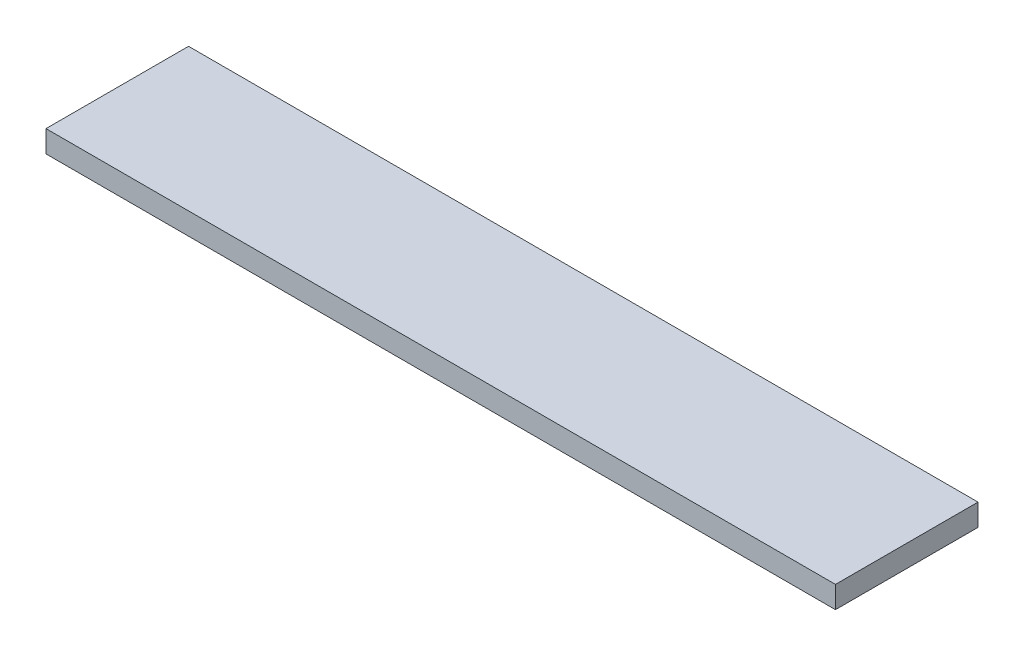
ISO-10303-21;
HEADER;
FILE_DESCRIPTION(('STEP AP214'),'2;1');
FILE_NAME('part.step','',(''),(''),'','','');
FILE_SCHEMA(('AUTOMOTIVE_DESIGN { 1 0 10303 214 1 1 1 1 }'));
ENDSEC;
DATA;
#1=APPLICATION_CONTEXT('core data for automotive mechanical design processes');
#2=APPLICATION_PROTOCOL_DEFINITION('international standard','automotive_design',2000,#1);
#3=PRODUCT_CONTEXT('',#1,'mechanical');
#4=PRODUCT('Part','Part','',(#3));
#5=PRODUCT_RELATED_PRODUCT_CATEGORY('part','',(#4));
#6=PRODUCT_DEFINITION_FORMATION('','',#4);
#7=PRODUCT_DEFINITION_CONTEXT('part definition',#1,'design');
#8=PRODUCT_DEFINITION('design','',#6,#7);
#9=PRODUCT_DEFINITION_SHAPE('','',#8);
#10=(LENGTH_UNIT() NAMED_UNIT(*) SI_UNIT(.MILLI.,.METRE.));
#11=(NAMED_UNIT(*) PLANE_ANGLE_UNIT() SI_UNIT($,.RADIAN.));
#12=(NAMED_UNIT(*) SI_UNIT($,.STERADIAN.) SOLID_ANGLE_UNIT());
#13=UNCERTAINTY_MEASURE_WITH_UNIT(LENGTH_MEASURE(1.E-05),#10,'distance_accuracy_value','');
#14=(GEOMETRIC_REPRESENTATION_CONTEXT(3) GLOBAL_UNCERTAINTY_ASSIGNED_CONTEXT((#13)) GLOBAL_UNIT_ASSIGNED_CONTEXT((#10,
#11,#12)) REPRESENTATION_CONTEXT('',''));
#15=CARTESIAN_POINT('',(0.,0.,0.));
#16=DIRECTION('',(0.,0.,1.));
#17=DIRECTION('',(1.,0.,0.));
#18=AXIS2_PLACEMENT_3D('',#15,#16,#17);
#19=CARTESIAN_POINT('',(228.6,12.7,-41.275));
#20=DIRECTION('',(-1.,0.,0.));
#21=DIRECTION('',(0.,0.,1.));
#22=AXIS2_PLACEMENT_3D('',#19,#20,#21);
#23=PLANE('',#22);
#24=DIRECTION('',(0.,0.,-1.));
#25=VECTOR('',#24,1.);
#26=CARTESIAN_POINT('',(228.6,0.,-41.275));
#27=LINE('',#26,#25);
#28=CARTESIAN_POINT('',(228.6,0.,41.275));
#29=VERTEX_POINT('',#28);
#30=CARTESIAN_POINT('',(228.6,0.,-41.275));
#31=VERTEX_POINT('',#30);
#32=EDGE_CURVE('E107',#29,#31,#27,.T.);
#33=ORIENTED_EDGE('',*,*,#32,.T.);
#34=DIRECTION('',(0.,-1.,0.));
#35=VECTOR('',#34,1.);
#36=CARTESIAN_POINT('',(228.6,12.7,-41.275));
#37=LINE('',#36,#35);
#38=CARTESIAN_POINT('',(228.6,12.7,-41.275));
#39=VERTEX_POINT('',#38);
#40=EDGE_CURVE('E11',#39,#31,#37,.T.);
#41=ORIENTED_EDGE('',*,*,#40,.F.);
#42=DIRECTION('',(0.,0.,-1.));
#43=VECTOR('',#42,1.);
#44=CARTESIAN_POINT('',(228.6,12.7,-41.275));
#45=LINE('',#44,#43);
#46=CARTESIAN_POINT('',(228.6,12.7,41.275));
#47=VERTEX_POINT('',#46);
#48=EDGE_CURVE('E91',#47,#39,#45,.T.);
#49=ORIENTED_EDGE('',*,*,#48,.F.);
#50=DIRECTION('',(0.,-1.,0.));
#51=VECTOR('',#50,1.);
#52=CARTESIAN_POINT('',(228.6,12.7,41.275));
#53=LINE('',#52,#51);
#54=EDGE_CURVE('E103',#47,#29,#53,.T.);
#55=ORIENTED_EDGE('',*,*,#54,.T.);
#56=EDGE_LOOP('',(#33,#41,#49,#55));
#57=FACE_BOUND('',#56,.T.);
#58=ADVANCED_FACE('F39',(#57),#23,.F.);
#59=CARTESIAN_POINT('',(-228.6,12.7,-41.275));
#60=DIRECTION('',(0.,0.,1.));
#61=DIRECTION('',(1.,0.,0.));
#62=AXIS2_PLACEMENT_3D('',#59,#60,#61);
#63=PLANE('',#62);
#64=DIRECTION('',(-1.,0.,0.));
#65=VECTOR('',#64,1.);
#66=CARTESIAN_POINT('',(-228.6,0.,-41.275));
#67=LINE('',#66,#65);
#68=CARTESIAN_POINT('',(-228.6,0.,-41.275));
#69=VERTEX_POINT('',#68);
#70=EDGE_CURVE('E96',#31,#69,#67,.T.);
#71=ORIENTED_EDGE('',*,*,#70,.T.);
#72=DIRECTION('',(0.,-1.,0.));
#73=VECTOR('',#72,1.);
#74=CARTESIAN_POINT('',(-228.6,12.7,-41.275));
#75=LINE('',#74,#73);
#76=CARTESIAN_POINT('',(-228.6,12.7,-41.275));
#77=VERTEX_POINT('',#76);
#78=EDGE_CURVE('E48',#77,#69,#75,.T.);
#79=ORIENTED_EDGE('',*,*,#78,.F.);
#80=DIRECTION('',(-1.,0.,0.));
#81=VECTOR('',#80,1.);
#82=CARTESIAN_POINT('',(-228.6,12.7,-41.275));
#83=LINE('',#82,#81);
#84=EDGE_CURVE('E86',#39,#77,#83,.T.);
#85=ORIENTED_EDGE('',*,*,#84,.F.);
#86=ORIENTED_EDGE('',*,*,#40,.T.);
#87=EDGE_LOOP('',(#71,#79,#85,#86));
#88=FACE_BOUND('',#87,.T.);
#89=ADVANCED_FACE('F95',(#88),#63,.F.);
#90=CARTESIAN_POINT('',(-228.6,12.7,-41.275));
#91=DIRECTION('',(1.,0.,0.));
#92=DIRECTION('',(0.,0.,-1.));
#93=AXIS2_PLACEMENT_3D('',#90,#91,#92);
#94=PLANE('',#93);
#95=DIRECTION('',(0.,0.,1.));
#96=VECTOR('',#95,1.);
#97=CARTESIAN_POINT('',(-228.6,0.,-41.275));
#98=LINE('',#97,#96);
#99=CARTESIAN_POINT('',(-228.6,0.,41.275));
#100=VERTEX_POINT('',#99);
#101=EDGE_CURVE('E73',#69,#100,#98,.T.);
#102=ORIENTED_EDGE('',*,*,#101,.T.);
#103=DIRECTION('',(0.,-1.,0.));
#104=VECTOR('',#103,1.);
#105=CARTESIAN_POINT('',(-228.6,12.7,41.275));
#106=LINE('',#105,#104);
#107=CARTESIAN_POINT('',(-228.6,12.7,41.275));
#108=VERTEX_POINT('',#107);
#109=EDGE_CURVE('E98',#108,#100,#106,.T.);
#110=ORIENTED_EDGE('',*,*,#109,.F.);
#111=DIRECTION('',(0.,0.,1.));
#112=VECTOR('',#111,1.);
#113=CARTESIAN_POINT('',(-228.6,12.7,-41.275));
#114=LINE('',#113,#112);
#115=EDGE_CURVE('E89',#77,#108,#114,.T.);
#116=ORIENTED_EDGE('',*,*,#115,.F.);
#117=ORIENTED_EDGE('',*,*,#78,.T.);
#118=EDGE_LOOP('',(#102,#110,#116,#117));
#119=FACE_BOUND('',#118,.T.);
#120=ADVANCED_FACE('F99',(#119),#94,.F.);
#121=CARTESIAN_POINT('',(-228.6,12.7,41.275));
#122=DIRECTION('',(0.,0.,-1.));
#123=DIRECTION('',(-1.,0.,0.));
#124=AXIS2_PLACEMENT_3D('',#121,#122,#123);
#125=PLANE('',#124);
#126=DIRECTION('',(1.,0.,0.));
#127=VECTOR('',#126,1.);
#128=CARTESIAN_POINT('',(-228.6,0.,41.275));
#129=LINE('',#128,#127);
#130=EDGE_CURVE('E79',#100,#29,#129,.T.);
#131=ORIENTED_EDGE('',*,*,#130,.T.);
#132=ORIENTED_EDGE('',*,*,#54,.F.);
#133=DIRECTION('',(1.,0.,0.));
#134=VECTOR('',#133,1.);
#135=CARTESIAN_POINT('',(-228.6,12.7,41.275));
#136=LINE('',#135,#134);
#137=EDGE_CURVE('E56',#108,#47,#136,.T.);
#138=ORIENTED_EDGE('',*,*,#137,.F.);
#139=ORIENTED_EDGE('',*,*,#109,.T.);
#140=EDGE_LOOP('',(#131,#132,#138,#139));
#141=FACE_BOUND('',#140,.T.);
#142=ADVANCED_FACE('F120',(#141),#125,.F.);
#143=CARTESIAN_POINT('',(0.,12.7,0.));
#144=DIRECTION('',(0.,1.,0.));
#145=DIRECTION('',(0.,0.,1.));
#146=AXIS2_PLACEMENT_3D('',#143,#144,#145);
#147=PLANE('',#146);
#148=ORIENTED_EDGE('',*,*,#48,.T.);
#149=ORIENTED_EDGE('',*,*,#84,.T.);
#150=ORIENTED_EDGE('',*,*,#115,.T.);
#151=ORIENTED_EDGE('',*,*,#137,.T.);
#152=EDGE_LOOP('',(#148,#149,#150,#151));
#153=FACE_BOUND('',#152,.T.);
#154=ADVANCED_FACE('F87',(#153),#147,.T.);
#155=CARTESIAN_POINT('',(0.,0.,0.));
#156=DIRECTION('',(0.,1.,0.));
#157=DIRECTION('',(0.,0.,1.));
#158=AXIS2_PLACEMENT_3D('',#155,#156,#157);
#159=PLANE('',#158);
#160=ORIENTED_EDGE('',*,*,#32,.F.);
#161=ORIENTED_EDGE('',*,*,#130,.F.);
#162=ORIENTED_EDGE('',*,*,#101,.F.);
#163=ORIENTED_EDGE('',*,*,#70,.F.);
#164=EDGE_LOOP('',(#160,#161,#162,#163));
#165=FACE_BOUND('',#164,.T.);
#166=ADVANCED_FACE('F123',(#165),#159,.F.);
#167=CLOSED_SHELL('',(#58,#89,#120,#142,#154,#166));
#168=MANIFOLD_SOLID_BREP('B2',#167);
#169=ADVANCED_BREP_SHAPE_REPRESENTATION('',(#18,#168),#14);
#170=SHAPE_DEFINITION_REPRESENTATION(#9,#169);
ENDSEC;
END-ISO-10303-21;
